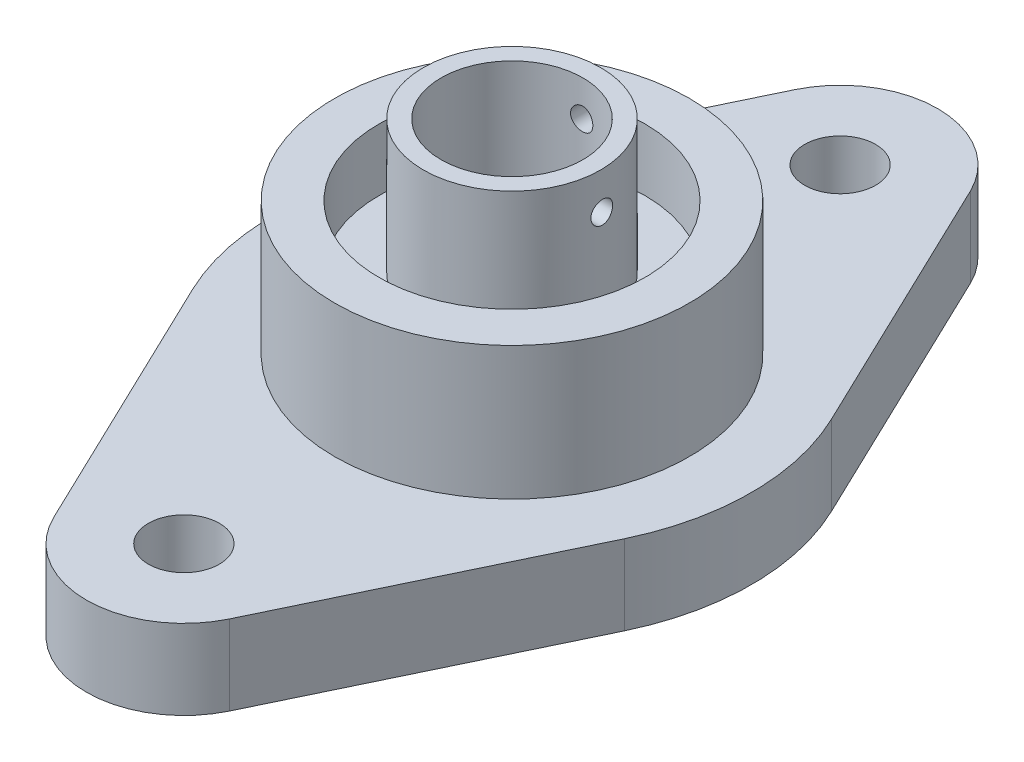
ISO-10303-21;
HEADER;
FILE_DESCRIPTION(('STEP AP214'),'2;1');
FILE_NAME('part.step','',(''),(''),'','','');
FILE_SCHEMA(('AUTOMOTIVE_DESIGN { 1 0 10303 214 1 1 1 1 }'));
ENDSEC;
DATA;
#1=APPLICATION_CONTEXT('core data for automotive mechanical design processes');
#2=APPLICATION_PROTOCOL_DEFINITION('international standard','automotive_design',2000,#1);
#3=PRODUCT_CONTEXT('',#1,'mechanical');
#4=PRODUCT('Part','Part','',(#3));
#5=PRODUCT_RELATED_PRODUCT_CATEGORY('part','',(#4));
#6=PRODUCT_DEFINITION_FORMATION('','',#4);
#7=PRODUCT_DEFINITION_CONTEXT('part definition',#1,'design');
#8=PRODUCT_DEFINITION('design','',#6,#7);
#9=PRODUCT_DEFINITION_SHAPE('','',#8);
#10=(LENGTH_UNIT() NAMED_UNIT(*) SI_UNIT(.MILLI.,.METRE.));
#11=(NAMED_UNIT(*) PLANE_ANGLE_UNIT() SI_UNIT($,.RADIAN.));
#12=(NAMED_UNIT(*) SI_UNIT($,.STERADIAN.) SOLID_ANGLE_UNIT());
#13=UNCERTAINTY_MEASURE_WITH_UNIT(LENGTH_MEASURE(1.E-05),#10,'distance_accuracy_value','');
#14=(GEOMETRIC_REPRESENTATION_CONTEXT(3) GLOBAL_UNCERTAINTY_ASSIGNED_CONTEXT((#13)) GLOBAL_UNIT_ASSIGNED_CONTEXT((#10,
#11,#12)) REPRESENTATION_CONTEXT('',''));
#15=CARTESIAN_POINT('',(0.,0.,0.));
#16=DIRECTION('',(0.,0.,1.));
#17=DIRECTION('',(1.,0.,0.));
#18=AXIS2_PLACEMENT_3D('',#15,#16,#17);
#19=CARTESIAN_POINT('',(0.,12.,0.));
#20=DIRECTION('',(0.,-1.,0.));
#21=DIRECTION('',(0.,0.,-1.));
#22=AXIS2_PLACEMENT_3D('',#19,#20,#21);
#23=CYLINDRICAL_SURFACE('',#22,10.);
#24=CARTESIAN_POINT('',(0.,12.,0.));
#25=DIRECTION('',(0.,-1.,0.));
#26=DIRECTION('',(0.,0.,-1.));
#27=AXIS2_PLACEMENT_3D('',#24,#25,#26);
#28=CIRCLE('',#27,10.);
#29=CARTESIAN_POINT('',(0.,12.,-10.));
#30=VERTEX_POINT('',#29);
#31=EDGE_CURVE('E173',#30,#30,#28,.T.);
#32=ORIENTED_EDGE('',*,*,#31,.T.);
#33=EDGE_LOOP('',(#32));
#34=FACE_BOUND('',#33,.T.);
#35=CARTESIAN_POINT('',(0.,4.5,0.));
#36=DIRECTION('',(0.,-1.,0.));
#37=DIRECTION('',(0.,0.,-1.));
#38=AXIS2_PLACEMENT_3D('',#35,#36,#37);
#39=CIRCLE('',#38,10.);
#40=CARTESIAN_POINT('',(0.,4.5,-10.));
#41=VERTEX_POINT('',#40);
#42=EDGE_CURVE('E141',#41,#41,#39,.T.);
#43=ORIENTED_EDGE('',*,*,#42,.F.);
#44=EDGE_LOOP('',(#43));
#45=FACE_BOUND('',#44,.T.);
#46=ADVANCED_FACE('F36',(#34,#45),#23,.T.);
#47=CARTESIAN_POINT('',(0.,16.,0.));
#48=DIRECTION('',(0.,-1.,0.));
#49=DIRECTION('',(0.,0.,-1.));
#50=AXIS2_PLACEMENT_3D('',#47,#48,#49);
#51=CYLINDRICAL_SURFACE('',#50,5.);
#52=CARTESIAN_POINT('',(4.94713772394498,13.8867766621203,-0.725140221143808));
#53=CARTESIAN_POINT('',(4.94713825606569,13.8518175911723,-0.725138745306085));
#54=CARTESIAN_POINT('',(4.94757066193573,13.8168366708941,-0.722205346936515));
#55=CARTESIAN_POINT('',(4.94925784164685,13.7478483557691,-0.710549195888205));
#56=CARTESIAN_POINT('',(4.95051347481366,13.713842016996,-0.701820393556703));
#57=CARTESIAN_POINT('',(4.9537177623288,13.6478116915913,-0.678832930891845));
#58=CARTESIAN_POINT('',(4.9556659462436,13.6157863765906,-0.664578023718644));
#59=CARTESIAN_POINT('',(4.96005953349321,13.5545945491645,-0.630948205704203));
#60=CARTESIAN_POINT('',(4.96250485181021,13.5254275491845,-0.611574170144945));
#61=CARTESIAN_POINT('',(4.96766548524129,13.4706111003398,-0.568136419447114));
#62=CARTESIAN_POINT('',(4.97038208876387,13.4449799615406,-0.544049748364305));
#63=CARTESIAN_POINT('',(4.97581190977607,13.3981209698855,-0.491915957729279));
#64=CARTESIAN_POINT('',(4.97852512709057,13.3768933360966,-0.463868641258232));
#65=CARTESIAN_POINT('',(4.98370108952014,13.3393782672437,-0.404491197575144));
#66=CARTESIAN_POINT('',(4.98616297668938,13.3231074008454,-0.373150521280687));
#67=CARTESIAN_POINT('',(4.99060183555131,13.2960738621351,-0.308145215958646));
#68=CARTESIAN_POINT('',(4.99257882524003,13.2853109853887,-0.274480673236262));
#69=CARTESIAN_POINT('',(4.99587295620351,13.2696536450367,-0.205968125544459));
#70=CARTESIAN_POINT('',(4.9971934990216,13.2647287424893,-0.171127241988965));
#71=CARTESIAN_POINT('',(4.99910059904821,13.2607928158612,-0.101093816942075));
#72=CARTESIAN_POINT('',(4.99968718513014,13.2617815591322,-0.0659012893390532));
#73=CARTESIAN_POINT('',(5.00011892339072,13.2696204628097,0.00362911137038026));
#74=CARTESIAN_POINT('',(4.99996819437897,13.2764378867406,0.0379706576001916));
#75=CARTESIAN_POINT('',(4.99900927280433,13.2956894562778,0.105031478518251));
#76=CARTESIAN_POINT('',(4.99820106774234,13.308123708662,0.137750722352783));
#77=CARTESIAN_POINT('',(4.99606858976305,13.3382907853162,0.20073713008717));
#78=CARTESIAN_POINT('',(4.99474293410139,13.3560377765528,0.230997459231532));
#79=CARTESIAN_POINT('',(4.99177336357546,13.3963162526743,0.288128957769094));
#80=CARTESIAN_POINT('',(4.99012943411539,13.4188479569874,0.314999971637234));
#81=CARTESIAN_POINT('',(4.98673884061538,13.4682396167699,0.364779019209942));
#82=CARTESIAN_POINT('',(4.98499155120858,13.495128102007,0.387658711909421));
#83=CARTESIAN_POINT('',(4.98164038892562,13.5523720513159,0.428581308517635));
#84=CARTESIAN_POINT('',(4.98003651649901,13.5827275262548,0.446624197265169));
#85=CARTESIAN_POINT('',(4.97718471068476,13.6460690360109,0.47735926254049));
#86=CARTESIAN_POINT('',(4.97593692869296,13.6790561821086,0.490049164279027));
#87=CARTESIAN_POINT('',(4.97396362965131,13.746711525502,0.50969024235337));
#88=CARTESIAN_POINT('',(4.97323808743216,13.7813796416975,0.51664169525574));
#89=CARTESIAN_POINT('',(4.97240816707805,13.8511624576202,0.524569415491981));
#90=CARTESIAN_POINT('',(4.972299632185,13.8862725678925,0.525585669339419));
#91=CARTESIAN_POINT('',(4.9727067546678,13.9561621445366,0.521719428526531));
#92=CARTESIAN_POINT('',(4.97322239873932,13.9909416179401,0.516837059594962));
#93=CARTESIAN_POINT('',(4.97480763022757,14.0590631030148,0.501346886727509));
#94=CARTESIAN_POINT('',(4.97587534408493,14.0924095659179,0.490758442400015));
#95=CARTESIAN_POINT('',(4.97842497726303,14.1568577008336,0.464178787940616));
#96=CARTESIAN_POINT('',(4.97990691113627,14.1879592939305,0.448187387986638));
#97=CARTESIAN_POINT('',(4.98310072503502,14.2472153230735,0.411160526114029));
#98=CARTESIAN_POINT('',(4.98481377803362,14.2753533284489,0.390098873465148));
#99=CARTESIAN_POINT('',(4.98823639954431,14.3277158006041,0.343570095608755));
#100=CARTESIAN_POINT('',(4.98994596791825,14.3519401150873,0.318102799040745));
#101=CARTESIAN_POINT('',(4.99313739683742,14.3959277089539,0.263314899440334));
#102=CARTESIAN_POINT('',(4.99461790392657,14.415664773819,0.233973160316838));
#103=CARTESIAN_POINT('',(4.99712270435212,14.4499362165287,0.17237597199492));
#104=CARTESIAN_POINT('',(4.99814700688424,14.4644706992405,0.140120581542708));
#105=CARTESIAN_POINT('',(4.99956673327385,14.4878811088473,0.0737017346616573));
#106=CARTESIAN_POINT('',(4.999963845206,14.4967721861282,0.0395436570340131));
#107=CARTESIAN_POINT('',(5.00003138907908,14.508692684427,-0.0297807474516453));
#108=CARTESIAN_POINT('',(4.99970185379033,14.5117223697701,-0.0649470287711411));
#109=CARTESIAN_POINT('',(4.99829834779281,14.5118291426933,-0.135033030707256));
#110=CARTESIAN_POINT('',(4.99722946517755,14.5089466522623,-0.169952798531847));
#111=CARTESIAN_POINT('',(4.99441337228877,14.4973965087626,-0.238793343418289));
#112=CARTESIAN_POINT('',(4.99266616248702,14.4887288597174,-0.272714121174894));
#113=CARTESIAN_POINT('',(4.98863169445674,14.4658671335329,-0.338590295974992));
#114=CARTESIAN_POINT('',(4.98634462551514,14.451674992277,-0.370546376947094));
#115=CARTESIAN_POINT('',(4.98142976817213,14.4181713334684,-0.43162170836908));
#116=CARTESIAN_POINT('',(4.97880197572033,14.3988597550549,-0.460740925088158));
#117=CARTESIAN_POINT('',(4.9734291270666,14.3555158582862,-0.515525496576239));
#118=CARTESIAN_POINT('',(4.97068341582527,14.3314534637394,-0.541166993116929));
#119=CARTESIAN_POINT('',(4.96535369998408,14.2793534261131,-0.588065681790942));
#120=CARTESIAN_POINT('',(4.9627697338425,14.2513148427476,-0.609321833954347));
#121=CARTESIAN_POINT('',(4.95800925485121,14.191934181446,-0.646920289136648));
#122=CARTESIAN_POINT('',(4.95583435398402,14.1605797646365,-0.663243299521477));
#123=CARTESIAN_POINT('',(4.95212725176997,14.0955624769716,-0.690380291157548));
#124=CARTESIAN_POINT('',(4.95059435173692,14.0619021622944,-0.701200264100645));
#125=CARTESIAN_POINT('',(4.9486976555333,14.0045191653594,-0.714436038000361));
#126=CARTESIAN_POINT('',(4.94811530648013,13.9811584242359,-0.718444370035397));
#127=CARTESIAN_POINT('',(4.94733516192253,13.9341273496286,-0.723796951347462));
#128=CARTESIAN_POINT('',(4.94713736350039,13.9104570184951,-0.725141220837516));
#129=CARTESIAN_POINT('',(4.94713772394498,13.8867766621203,-0.725140221143808));
#130=B_SPLINE_CURVE_WITH_KNOTS('',3,(#52,#53,#54,#55,#56,#57,#58,#59,#60,#61,#62,#63,#64,#65,
#66,#67,#68,#69,#70,#71,#72,#73,#74,#75,#76,#77,#78,#79,#80,#81,#82,#83,#84,#85,#86,#87,#88,#89,
#90,#91,#92,#93,#94,#95,#96,#97,#98,#99,#100,#101,#102,#103,#104,#105,#106,#107,#108,#109,#110,
#111,#112,#113,#114,#115,#116,#117,#118,#119,#120,#121,#122,#123,#124,#125,#126,#127,#128,#129),
.UNSPECIFIED.,.T.,.F.,(4,2,2,2,2,2,2,2,2,2,2,2,2,2,2,2,2,2,2,2,2,2,2,2,2,2,2,2,2,2,2,2,2,2,2,2,
2,2,4),(0.,0.104790704369808,0.209690969038095,0.314520113145303,0.419331344876532,
0.524666443872664,0.630006781856446,0.735695465364351,0.841380225849575,0.946511492353643,
1.05163862292527,1.15617916233259,1.26072168917947,1.36554551103201,1.47037414117276,
1.57591924344442,1.68146467654856,1.78705491684752,1.89264006789047,1.99751304451471,
2.10238378581779,2.20690094073183,2.31142176802963,2.41649454886028,2.52157141748703,
2.62724721473085,2.73292088177219,2.83830964196235,2.94369364943203,3.04835954072064,
3.15302535921697,3.25765453386022,3.36228495241062,3.46760032222709,3.57294063859957,
3.67868774426208,3.78431946495504,3.85530247408237,3.92628494463868),.UNSPECIFIED.);
#131=CARTESIAN_POINT('',(4.94713772394498,13.8867766621203,-0.725140221143808));
#132=VERTEX_POINT('',#131);
#133=EDGE_CURVE('E468',#132,#132,#130,.T.);
#134=ORIENTED_EDGE('',*,*,#133,.T.);
#135=EDGE_LOOP('',(#134));
#136=FACE_BOUND('',#135,.T.);
#137=CARTESIAN_POINT('',(0.,14.607453731981,-5.));
#138=CARTESIAN_POINT('',(-0.0348990786235977,14.6090409833359,-4.99999950745355));
#139=CARTESIAN_POINT('',(-0.0699533404629345,14.6076964405771,-4.99963074611788));
#140=CARTESIAN_POINT('',(-0.139354207996636,14.5991706109528,-4.99817853173998));
#141=CARTESIAN_POINT('',(-0.173700048696205,14.5919833217477,-4.99709434394535));
#142=CARTESIAN_POINT('',(-0.24066560791235,14.5719861694536,-4.99431702296796));
#143=CARTESIAN_POINT('',(-0.273286421961319,14.5591799241023,-4.99262428172586));
#144=CARTESIAN_POINT('',(-0.335905598031991,14.5283186042426,-4.98880272458806));
#145=CARTESIAN_POINT('',(-0.365904401202672,14.5102644149118,-4.98667398225111));
#146=CARTESIAN_POINT('',(-0.422592256967548,14.4693206497872,-4.9821912013479));
#147=CARTESIAN_POINT('',(-0.449265309510713,14.4464090304725,-4.97983616341303));
#148=CARTESIAN_POINT('',(-0.498400742647147,14.3964398990314,-4.97515901764027));
#149=CARTESIAN_POINT('',(-0.520862880488868,14.3693821480513,-4.97283691170797));
#150=CARTESIAN_POINT('',(-0.561036811924267,14.3117435986718,-4.96846547156364));
#151=CARTESIAN_POINT('',(-0.578727177493775,14.2811477618756,-4.96641738793399));
#152=CARTESIAN_POINT('',(-0.608716516738866,14.2173911293658,-4.9628311976545));
#153=CARTESIAN_POINT('',(-0.62101565822422,14.1842304135256,-4.96129307513173));
#154=CARTESIAN_POINT('',(-0.63982034280399,14.1164339474778,-4.95890312118309));
#155=CARTESIAN_POINT('',(-0.646350457189598,14.0818051178657,-4.95804838060838));
#156=CARTESIAN_POINT('',(-0.653511453597567,14.0119331603042,-4.95710966228365));
#157=CARTESIAN_POINT('',(-0.654142602864343,13.976690060256,-4.95702564961687));
#158=CARTESIAN_POINT('',(-0.649502352514769,13.9068280771058,-4.95763570792191));
#159=CARTESIAN_POINT('',(-0.644268497525465,13.8722066486604,-4.9583248297326));
#160=CARTESIAN_POINT('',(-0.628113582074112,13.8043392537621,-4.96039705595205));
#161=CARTESIAN_POINT('',(-0.617192451440327,13.7710933042858,-4.96178016892352));
#162=CARTESIAN_POINT('',(-0.589958934725137,13.706858391694,-4.96509172145371));
#163=CARTESIAN_POINT('',(-0.573638322737793,13.675872960848,-4.96702099241225));
#164=CARTESIAN_POINT('',(-0.536073000190021,13.6170714478374,-4.97121530889957));
#165=CARTESIAN_POINT('',(-0.514828061561889,13.5892555125554,-4.97348036997856));
#166=CARTESIAN_POINT('',(-0.467838649719816,13.5373757070118,-4.97812081484077));
#167=CARTESIAN_POINT('',(-0.442063602619569,13.5133395806667,-4.98049686210371));
#168=CARTESIAN_POINT('',(-0.386834833384578,13.4699295923599,-4.98509029487401));
#169=CARTESIAN_POINT('',(-0.357381070174703,13.450555782463,-4.98730767860936));
#170=CARTESIAN_POINT('',(-0.295565836500636,13.4169947385871,-4.99135256890982));
#171=CARTESIAN_POINT('',(-0.263199763103714,13.4028159012417,-4.99317944232546));
#172=CARTESIAN_POINT('',(-0.196517676739934,13.3801044011434,-4.99624796247671));
#173=CARTESIAN_POINT('',(-0.162201749481776,13.3715714904236,-4.99748963491342));
#174=CARTESIAN_POINT('',(-0.0928221125703909,13.3604412189474,-4.99925798024883));
#175=CARTESIAN_POINT('',(-0.0577643942774412,13.3578072070568,-4.99978905986317));
#176=CARTESIAN_POINT('',(0.0122999535595478,13.3584453617253,-5.00010758883449));
#177=CARTESIAN_POINT('',(0.0473065845348258,13.3617173595171,-4.99989505944032));
#178=CARTESIAN_POINT('',(0.116116897679981,13.3740421478164,-4.99876949049106));
#179=CARTESIAN_POINT('',(0.149925142394937,13.3830697808285,-4.99785949602671));
#180=CARTESIAN_POINT('',(0.215548939611965,13.406618175544,-4.99545970710277));
#181=CARTESIAN_POINT('',(0.247364436466622,13.4211390905676,-4.99396989646019));
#182=CARTESIAN_POINT('',(0.308248953747447,13.4553316942846,-4.99058286203805));
#183=CARTESIAN_POINT('',(0.337305780705717,13.475024921935,-4.98868394069376));
#184=CARTESIAN_POINT('',(0.3917169066205,13.5189794609665,-4.98470695318134));
#185=CARTESIAN_POINT('',(0.417071044018995,13.543240971568,-4.98262887920261));
#186=CARTESIAN_POINT('',(0.463521230467004,13.5958266843897,-4.97852352829136));
#187=CARTESIAN_POINT('',(0.484589366710118,13.6241755847198,-4.97649665521401));
#188=CARTESIAN_POINT('',(0.52166642628248,13.6840271730162,-4.97274699846433));
#189=CARTESIAN_POINT('',(0.537675405567654,13.7155298260958,-4.9710242114288));
#190=CARTESIAN_POINT('',(0.564151090067189,13.7807560735333,-4.96808934918778));
#191=CARTESIAN_POINT('',(0.574625474591577,13.8144765171955,-4.96687656682513));
#192=CARTESIAN_POINT('',(0.58975397425783,13.8832148968479,-4.96510312009983));
#193=CARTESIAN_POINT('',(0.594408367247411,13.9182327708163,-4.96454242460648));
#194=CARTESIAN_POINT('',(0.597745261301449,13.9883085967834,-4.96414176441681));
#195=CARTESIAN_POINT('',(0.596469493173449,14.0233645383625,-4.96429676329614));
#196=CARTESIAN_POINT('',(0.588079892575132,14.0927600334134,-4.96529752624628));
#197=CARTESIAN_POINT('',(0.580966109412059,14.1270995929332,-4.96614328448301));
#198=CARTESIAN_POINT('',(0.56112791289088,14.1940342678777,-4.96842370393741));
#199=CARTESIAN_POINT('',(0.548412735902528,14.2266321564078,-4.9698573954198));
#200=CARTESIAN_POINT('',(0.517741556121543,14.289237025161,-4.9731459248822));
#201=CARTESIAN_POINT('',(0.499785503659278,14.3192439808253,-4.97500076685357));
#202=CARTESIAN_POINT('',(0.459011828816326,14.3760184341958,-4.97892849124653));
#203=CARTESIAN_POINT('',(0.436164715665284,14.402764663221,-4.9810026558697));
#204=CARTESIAN_POINT('',(0.386308465565209,14.4520635862687,-4.98511684298613));
#205=CARTESIAN_POINT('',(0.359298320206447,14.4746152613174,-4.98715685707404));
#206=CARTESIAN_POINT('',(0.301732842808365,14.5149844508981,-4.99097111433494));
#207=CARTESIAN_POINT('',(0.27116088376575,14.5327783713772,-4.9927440145996));
#208=CARTESIAN_POINT('',(0.207459439867549,14.5629591249918,-4.99579554810902));
#209=CARTESIAN_POINT('',(0.174332756213826,14.5753517840147,-4.99707471373259));
#210=CARTESIAN_POINT('',(0.11754052986544,14.5912843135636,-4.99867086192337));
#211=CARTESIAN_POINT('',(0.0943075235513967,14.5963929137859,-4.99916553230591));
#212=CARTESIAN_POINT('',(0.0474069445395791,14.6039377664027,-4.99983026775193));
#213=CARTESIAN_POINT('',(0.0237393748271242,14.6063740371482,-5.00000033504451));
#214=CARTESIAN_POINT('',(0.,14.607453731981,-5.));
#215=B_SPLINE_CURVE_WITH_KNOTS('',3,(#137,#138,#139,#140,#141,#142,#143,#144,#145,#146,#147,
#148,#149,#150,#151,#152,#153,#154,#155,#156,#157,#158,#159,#160,#161,#162,#163,#164,#165,#166,
#167,#168,#169,#170,#171,#172,#173,#174,#175,#176,#177,#178,#179,#180,#181,#182,#183,#184,#185,
#186,#187,#188,#189,#190,#191,#192,#193,#194,#195,#196,#197,#198,#199,#200,#201,#202,#203,#204,
#205,#206,#207,#208,#209,#210,#211,#212,#213,#214),.UNSPECIFIED.,.T.,.F.,(4,2,2,2,2,2,2,2,2,2,2,
2,2,2,2,2,2,2,2,2,2,2,2,2,2,2,2,2,2,2,2,2,2,2,2,2,2,2,4),(0.,0.104718779087226,
0.209545273474578,0.31430437464196,0.419045816199098,0.524273168898632,0.629506585898842,
0.735204978806177,0.840900081462057,0.946142809251875,1.05138076914309,1.15594888096957,
1.26051828302715,1.36524773190106,1.46998203223613,1.57545241779691,1.68092398110482,
1.78656527380671,1.89220192647677,1.99718039312081,2.10215585999827,2.2066756027895,
2.3111982629908,2.41616328283523,2.52113288121021,2.62676563486297,2.73239722014215,
2.8378818530133,2.94336144983188,3.04809991026021,3.15283748608791,3.25740299850829,
3.36196950196521,3.4671852029078,3.57242643038134,3.67818026411316,3.78381974605637,
3.85505301403237,3.92628579284017),.UNSPECIFIED.);
#216=CARTESIAN_POINT('',(0.,14.607453731981,-5.));
#217=VERTEX_POINT('',#216);
#218=EDGE_CURVE('E305',#217,#217,#215,.T.);
#219=ORIENTED_EDGE('',*,*,#218,.T.);
#220=EDGE_LOOP('',(#219));
#221=FACE_BOUND('',#220,.T.);
#222=CARTESIAN_POINT('',(0.,16.,0.));
#223=DIRECTION('',(0.,1.,0.));
#224=DIRECTION('',(0.,0.,1.));
#225=AXIS2_PLACEMENT_3D('',#222,#223,#224);
#226=CIRCLE('',#225,5.);
#227=CARTESIAN_POINT('',(0.,16.,5.));
#228=VERTEX_POINT('',#227);
#229=EDGE_CURVE('E46',#228,#228,#226,.T.);
#230=ORIENTED_EDGE('',*,*,#229,.F.);
#231=EDGE_LOOP('',(#230));
#232=FACE_BOUND('',#231,.T.);
#233=CARTESIAN_POINT('',(0.,8.5,0.));
#234=DIRECTION('',(0.,-1.,0.));
#235=DIRECTION('',(0.,0.,-1.));
#236=AXIS2_PLACEMENT_3D('',#233,#234,#235);
#237=CIRCLE('',#236,5.);
#238=CARTESIAN_POINT('',(0.,8.5,-5.));
#239=VERTEX_POINT('',#238);
#240=EDGE_CURVE('E11',#239,#239,#237,.T.);
#241=ORIENTED_EDGE('',*,*,#240,.F.);
#242=EDGE_LOOP('',(#241));
#243=FACE_BOUND('',#242,.T.);
#244=ADVANCED_FACE('F38',(#136,#221,#232,#243),#51,.T.);
#245=CARTESIAN_POINT('',(0.,16.,0.));
#246=DIRECTION('',(0.,1.,0.));
#247=DIRECTION('',(0.,0.,1.));
#248=AXIS2_PLACEMENT_3D('',#245,#246,#247);
#249=PLANE('',#248);
#250=ORIENTED_EDGE('',*,*,#229,.T.);
#251=EDGE_LOOP('',(#250));
#252=FACE_BOUND('',#251,.T.);
#253=CARTESIAN_POINT('',(0.,16.,0.));
#254=DIRECTION('',(0.,1.,0.));
#255=DIRECTION('',(0.,0.,1.));
#256=AXIS2_PLACEMENT_3D('',#253,#254,#255);
#257=CIRCLE('',#256,4.);
#258=CARTESIAN_POINT('',(0.,16.,4.));
#259=VERTEX_POINT('',#258);
#260=EDGE_CURVE('E180',#259,#259,#257,.T.);
#261=ORIENTED_EDGE('',*,*,#260,.F.);
#262=EDGE_LOOP('',(#261));
#263=FACE_BOUND('',#262,.T.);
#264=ADVANCED_FACE('F187',(#252,#263),#249,.T.);
#265=CARTESIAN_POINT('',(0.,0.,0.));
#266=DIRECTION('',(0.,1.,0.));
#267=DIRECTION('',(0.,0.,1.));
#268=AXIS2_PLACEMENT_3D('',#265,#266,#267);
#269=PLANE('',#268);
#270=CARTESIAN_POINT('',(0.,0.,0.));
#271=DIRECTION('',(0.,1.,0.));
#272=DIRECTION('',(0.,0.,1.));
#273=AXIS2_PLACEMENT_3D('',#270,#271,#272);
#274=CIRCLE('',#273,4.);
#275=CARTESIAN_POINT('',(0.,0.,4.));
#276=VERTEX_POINT('',#275);
#277=EDGE_CURVE('E179',#276,#276,#274,.T.);
#278=ORIENTED_EDGE('',*,*,#277,.T.);
#279=EDGE_LOOP('',(#278));
#280=FACE_BOUND('',#279,.T.);
#281=CARTESIAN_POINT('',(0.,0.,-18.5));
#282=DIRECTION('',(0.,-1.,0.));
#283=DIRECTION('',(0.,0.,-1.));
#284=AXIS2_PLACEMENT_3D('',#281,#282,#283);
#285=CIRCLE('',#284,2.);
#286=CARTESIAN_POINT('',(0.,0.,-20.5));
#287=VERTEX_POINT('',#286);
#288=EDGE_CURVE('E236',#287,#287,#285,.T.);
#289=ORIENTED_EDGE('',*,*,#288,.F.);
#290=EDGE_LOOP('',(#289));
#291=FACE_BOUND('',#290,.T.);
#292=CARTESIAN_POINT('',(0.,0.,18.5));
#293=DIRECTION('',(0.,-1.,0.));
#294=DIRECTION('',(0.,0.,-1.));
#295=AXIS2_PLACEMENT_3D('',#292,#293,#294);
#296=CIRCLE('',#295,2.);
#297=CARTESIAN_POINT('',(0.,0.,16.5));
#298=VERTEX_POINT('',#297);
#299=EDGE_CURVE('E240',#298,#298,#296,.T.);
#300=ORIENTED_EDGE('',*,*,#299,.F.);
#301=EDGE_LOOP('',(#300));
#302=FACE_BOUND('',#301,.T.);
#303=CARTESIAN_POINT('',(0.,0.,-18.5));
#304=DIRECTION('',(0.,-1.,0.));
#305=DIRECTION('',(0.,0.,-1.));
#306=AXIS2_PLACEMENT_3D('',#303,#304,#305);
#307=CIRCLE('',#306,5.5);
#308=CARTESIAN_POINT('',(-4.95916487820906,0.,-20.8783783783784));
#309=VERTEX_POINT('',#308);
#310=CARTESIAN_POINT('',(4.95916487820906,0.,-20.8783783783784));
#311=VERTEX_POINT('',#310);
#312=EDGE_CURVE('E137',#309,#311,#307,.T.);
#313=ORIENTED_EDGE('',*,*,#312,.T.);
#314=DIRECTION('',(0.432432432432432,0.,0.901666341492556));
#315=VECTOR('',#314,1.);
#316=CARTESIAN_POINT('',(4.95916487820906,0.,-20.8783783783784));
#317=LINE('',#316,#315);
#318=CARTESIAN_POINT('',(12.1724956101495,0.,-5.83783783783784));
#319=VERTEX_POINT('',#318);
#320=EDGE_CURVE('E140',#311,#319,#317,.T.);
#321=ORIENTED_EDGE('',*,*,#320,.T.);
#322=CARTESIAN_POINT('',(0.,0.,0.));
#323=DIRECTION('',(0.,-1.,0.));
#324=DIRECTION('',(0.,0.,-1.));
#325=AXIS2_PLACEMENT_3D('',#322,#323,#324);
#326=CIRCLE('',#325,13.5);
#327=CARTESIAN_POINT('',(12.1724956101495,0.,5.83783783783784));
#328=VERTEX_POINT('',#327);
#329=EDGE_CURVE('E144',#319,#328,#326,.T.);
#330=ORIENTED_EDGE('',*,*,#329,.T.);
#331=DIRECTION('',(-0.432432432432432,0.,0.901666341492555));
#332=VECTOR('',#331,1.);
#333=CARTESIAN_POINT('',(12.1724956101495,0.,5.83783783783784));
#334=LINE('',#333,#332);
#335=CARTESIAN_POINT('',(4.95916487820906,0.,20.8783783783784));
#336=VERTEX_POINT('',#335);
#337=EDGE_CURVE('E147',#328,#336,#334,.T.);
#338=ORIENTED_EDGE('',*,*,#337,.T.);
#339=CARTESIAN_POINT('',(0.,0.,18.5));
#340=DIRECTION('',(0.,-1.,0.));
#341=DIRECTION('',(0.,0.,-1.));
#342=AXIS2_PLACEMENT_3D('',#339,#340,#341);
#343=CIRCLE('',#342,5.5);
#344=CARTESIAN_POINT('',(-4.95916487820905,0.,20.8783783783784));
#345=VERTEX_POINT('',#344);
#346=EDGE_CURVE('E150',#336,#345,#343,.T.);
#347=ORIENTED_EDGE('',*,*,#346,.T.);
#348=DIRECTION('',(-0.432432432432432,0.,-0.901666341492555));
#349=VECTOR('',#348,1.);
#350=CARTESIAN_POINT('',(-12.1724956101495,0.,5.83783783783784));
#351=LINE('',#350,#349);
#352=CARTESIAN_POINT('',(-12.1724956101495,0.,5.83783783783784));
#353=VERTEX_POINT('',#352);
#354=EDGE_CURVE('E153',#345,#353,#351,.T.);
#355=ORIENTED_EDGE('',*,*,#354,.T.);
#356=CARTESIAN_POINT('',(0.,0.,0.));
#357=DIRECTION('',(0.,-1.,0.));
#358=DIRECTION('',(0.,0.,-1.));
#359=AXIS2_PLACEMENT_3D('',#356,#357,#358);
#360=CIRCLE('',#359,13.5);
#361=CARTESIAN_POINT('',(-12.1724956101495,0.,-5.83783783783784));
#362=VERTEX_POINT('',#361);
#363=EDGE_CURVE('E114',#353,#362,#360,.T.);
#364=ORIENTED_EDGE('',*,*,#363,.T.);
#365=DIRECTION('',(0.432432432432432,0.,-0.901666341492556));
#366=VECTOR('',#365,1.);
#367=CARTESIAN_POINT('',(-4.95916487820906,0.,-20.8783783783784));
#368=LINE('',#367,#366);
#369=EDGE_CURVE('E156',#362,#309,#368,.T.);
#370=ORIENTED_EDGE('',*,*,#369,.T.);
#371=EDGE_LOOP('',(#313,#321,#330,#338,#347,#355,#364,#370));
#372=FACE_BOUND('',#371,.T.);
#373=ADVANCED_FACE('F224',(#280,#291,#302,#372),#269,.F.);
#374=CARTESIAN_POINT('',(0.,16.,0.));
#375=DIRECTION('',(0.,-1.,0.));
#376=DIRECTION('',(0.,0.,-1.));
#377=AXIS2_PLACEMENT_3D('',#374,#375,#376);
#378=CYLINDRICAL_SURFACE('',#377,4.);
#379=CARTESIAN_POINT('',(3.93743048374927,13.8867766621203,-0.704727738663629));
#380=CARTESIAN_POINT('',(3.93743111388884,13.8519008175385,-0.704726324059104));
#381=CARTESIAN_POINT('',(3.9379563845063,13.8170051627092,-0.701808716270004));
#382=CARTESIAN_POINT('',(3.9400040441188,13.748190754879,-0.690218400812287));
#383=CARTESIAN_POINT('',(3.9415273864169,13.7142729682523,-0.681540190829657));
#384=CARTESIAN_POINT('',(3.94540953033083,13.6484202647059,-0.658693397987712));
#385=CARTESIAN_POINT('',(3.94776766996881,13.6164838001517,-0.644529164601932));
#386=CARTESIAN_POINT('',(3.95307702039055,13.5554524394107,-0.611119344863482));
#387=CARTESIAN_POINT('',(3.95602815494586,13.5263571787057,-0.591874411526111));
#388=CARTESIAN_POINT('',(3.96225231240645,13.4715775408322,-0.5486668844649));
#389=CARTESIAN_POINT('',(3.96552765612365,13.4459213935203,-0.524668829879256));
#390=CARTESIAN_POINT('',(3.97205633717347,13.3989931070129,-0.472707904350333));
#391=CARTESIAN_POINT('',(3.97530967325245,13.3777212155642,-0.44474480949996));
#392=CARTESIAN_POINT('',(3.9814960351793,13.34006044286,-0.385461747920042));
#393=CARTESIAN_POINT('',(3.98442729823708,13.3236976611267,-0.354125001908607));
#394=CARTESIAN_POINT('',(3.9896726244237,13.296487173439,-0.289093797436651));
#395=CARTESIAN_POINT('',(3.99198672288049,13.2856391517746,-0.255399474068847));
#396=CARTESIAN_POINT('',(3.99577725641529,13.2698519823813,-0.186897596129903));
#397=CARTESIAN_POINT('',(3.99726035051072,13.2648654998532,-0.152101322891659));
#398=CARTESIAN_POINT('',(3.99930961511527,13.2607959012945,-0.082139546519149));
#399=CARTESIAN_POINT('',(3.99987584071949,13.2617124305323,-0.0469740656985691));
#400=CARTESIAN_POINT('',(4.0000864350675,13.2693856436898,0.0224044174494028));
#401=CARTESIAN_POINT('',(3.99973878921609,13.2760913968304,0.0566230476896054));
#402=CARTESIAN_POINT('',(3.99823409458574,13.295072669276,0.123459572668431));
#403=CARTESIAN_POINT('',(3.99707702355366,13.3073483417088,0.156077423371188));
#404=CARTESIAN_POINT('',(3.99412841361293,13.3371725760853,0.218936824622381));
#405=CARTESIAN_POINT('',(3.99233430939574,13.3547424134773,0.249168154056657));
#406=CARTESIAN_POINT('',(3.9883597039418,13.3946406822776,0.306280372867824));
#407=CARTESIAN_POINT('',(3.98617917514582,13.416969453109,0.33316102304619));
#408=CARTESIAN_POINT('',(3.98169146516916,13.4660350338886,0.38310537843924));
#409=CARTESIAN_POINT('',(3.9793831809967,13.492816328719,0.406125304100341));
#410=CARTESIAN_POINT('',(3.97496059010698,13.5498760532908,0.447347116094155));
#411=CARTESIAN_POINT('',(3.97284628478529,13.5801545081888,0.465548967765308));
#412=CARTESIAN_POINT('',(3.96908230731476,13.6433965691467,0.496620580911637));
#413=CARTESIAN_POINT('',(3.96743305301343,13.6763625558887,0.509485552067579));
#414=CARTESIAN_POINT('',(3.96481586897039,13.7440178742967,0.52946923136137));
#415=CARTESIAN_POINT('',(3.96384788690177,13.7787070733877,0.536588380828407));
#416=CARTESIAN_POINT('',(3.96272549119939,13.8484336879391,0.544815557612071));
#417=CARTESIAN_POINT('',(3.96256263410272,13.883463612169,0.545985973830055));
#418=CARTESIAN_POINT('',(3.96304848474723,13.9532185709448,0.54244794505069));
#419=CARTESIAN_POINT('',(3.96369716508228,13.9879436157468,0.537739698579448));
#420=CARTESIAN_POINT('',(3.96571714197399,14.0559086139869,0.522632291616115));
#421=CARTESIAN_POINT('',(3.96708445986583,14.0891556617802,0.512264452803947));
#422=CARTESIAN_POINT('',(3.97036687009455,14.1534451548963,0.486167510793675));
#423=CARTESIAN_POINT('',(3.97228199158345,14.1844874827825,0.470438122265931));
#424=CARTESIAN_POINT('',(3.97643723641938,14.2437644825325,0.433919459689403));
#425=CARTESIAN_POINT('',(3.97867988050385,14.2719742193453,0.413090005775163));
#426=CARTESIAN_POINT('',(3.9831932737684,14.3245284073323,0.367022726955648));
#427=CARTESIAN_POINT('',(3.98546402466963,14.3488726205221,0.341784630828937));
#428=CARTESIAN_POINT('',(3.98975976819836,14.3932294797792,0.287346109402204));
#429=CARTESIAN_POINT('',(3.99178234321388,14.4132008062278,0.258111800232547));
#430=CARTESIAN_POINT('',(3.99528015403923,14.4479565421179,0.196676793992626));
#431=CARTESIAN_POINT('',(3.99675540584352,14.4627411031318,0.164476183641129));
#432=CARTESIAN_POINT('',(3.99893254955454,14.4866382309413,0.0981531077846489));
#433=CARTESIAN_POINT('',(3.99963748213363,14.4957730364801,0.0640387615029161));
#434=CARTESIAN_POINT('',(4.00014647433593,14.5081831952885,-0.00524547953268113));
#435=CARTESIAN_POINT('',(3.99995059875191,14.5114589699593,-0.040415298188401));
#436=CARTESIAN_POINT('',(3.99862749207636,14.5120471252841,-0.110411290291849));
#437=CARTESIAN_POINT('',(3.9975101947951,14.509422598281,-0.145237137692507));
#438=CARTESIAN_POINT('',(3.99442326055469,14.4984203330752,-0.213928068456903));
#439=CARTESIAN_POINT('',(3.99245362702569,14.4900426180257,-0.247793155686557));
#440=CARTESIAN_POINT('',(3.98782557207148,14.4677948471922,-0.313583637192414));
#441=CARTESIAN_POINT('',(3.98516774486378,14.453929524225,-0.345510675653852));
#442=CARTESIAN_POINT('',(3.97940083146641,14.4211069524899,-0.406584659708774));
#443=CARTESIAN_POINT('',(3.9762917281441,14.4021495103771,-0.435731499682721));
#444=CARTESIAN_POINT('',(3.96988029533264,14.3594543013179,-0.490740451240068));
#445=CARTESIAN_POINT('',(3.96657632835361,14.335670083543,-0.516566322694238));
#446=CARTESIAN_POINT('',(3.96012702393599,14.2840941727877,-0.563884493205164));
#447=CARTESIAN_POINT('',(3.95698172386442,14.2563015416938,-0.585375774979653));
#448=CARTESIAN_POINT('',(3.95114862207436,14.1972963860475,-0.623538804297772));
#449=CARTESIAN_POINT('',(3.94846374614632,14.1660639224517,-0.640180168398394));
#450=CARTESIAN_POINT('',(3.94385819355486,14.1012158576965,-0.667969060985544));
#451=CARTESIAN_POINT('',(3.94193673492912,14.0676027368368,-0.679122213812007));
#452=CARTESIAN_POINT('',(3.93949291790551,14.0093342271985,-0.693129322811578));
#453=CARTESIAN_POINT('',(3.93872333905223,13.985036262125,-0.697472010943768));
#454=CARTESIAN_POINT('',(3.93769190292971,13.9360877168578,-0.70327169774548));
#455=CARTESIAN_POINT('',(3.93743003818174,13.9114371418636,-0.704728738921161));
#456=CARTESIAN_POINT('',(3.93743048374927,13.8867766621203,-0.704727738663629));
#457=B_SPLINE_CURVE_WITH_KNOTS('',3,(#379,#380,#381,#382,#383,#384,#385,#386,#387,#388,#389,
#390,#391,#392,#393,#394,#395,#396,#397,#398,#399,#400,#401,#402,#403,#404,#405,#406,#407,#408,
#409,#410,#411,#412,#413,#414,#415,#416,#417,#418,#419,#420,#421,#422,#423,#424,#425,#426,#427,
#428,#429,#430,#431,#432,#433,#434,#435,#436,#437,#438,#439,#440,#441,#442,#443,#444,#445,#446,
#447,#448,#449,#450,#451,#452,#453,#454,#455,#456),.UNSPECIFIED.,.T.,.F.,(4,2,2,2,2,2,2,2,2,2,2,
2,2,2,2,2,2,2,2,2,2,2,2,2,2,2,2,2,2,2,2,2,2,2,2,2,2,2,4),(0.,0.104537381970647,
0.209174758133979,0.313729344103093,0.418270498353517,0.523623145118175,0.628981743551664,
0.734890945046198,0.840794082746893,0.945835993784252,1.05087159256628,1.15499244786742,
1.2591161658269,1.36366403231754,1.46821935800937,1.57389010847868,1.6795616191301,
1.78532777508708,1.89108580650809,1.99573235007661,2.10037535976162,2.20444503362056,
2.30852024669885,2.41344338208291,2.51837297465507,2.62425492998867,2.73013379088243,
2.83559319057106,2.94104500495909,3.04537458517296,3.14970374552502,3.2539431220284,
3.3581864570022,3.46348510099499,3.56880842878145,3.67477805414639,3.78063885408471,
3.85455763643566,3.92847532994002),.UNSPECIFIED.);
#458=CARTESIAN_POINT('',(3.93743048374927,13.8867766621203,-0.704727738663629));
#459=VERTEX_POINT('',#458);
#460=EDGE_CURVE('E465',#459,#459,#457,.T.);
#461=ORIENTED_EDGE('',*,*,#460,.F.);
#462=EDGE_LOOP('',(#461));
#463=FACE_BOUND('',#462,.T.);
#464=CARTESIAN_POINT('',(0.,14.6076865997547,-4.));
#465=CARTESIAN_POINT('',(-0.0348242114303786,14.6089529689373,-3.99999942212039));
#466=CARTESIAN_POINT('',(-0.0697743038189787,14.6073008056298,-3.99954046377523));
#467=CARTESIAN_POINT('',(-0.138909600620988,14.598197982387,-3.99773726264242));
#468=CARTESIAN_POINT('',(-0.17309405953201,14.5907419038522,-3.99639219275165));
#469=CARTESIAN_POINT('',(-0.239684616219135,14.5702601037972,-3.99295157035486));
#470=CARTESIAN_POINT('',(-0.272092013758414,14.5572385159561,-3.99085657502934));
#471=CARTESIAN_POINT('',(-0.334252134674253,14.5260085825345,-3.98613200295987));
#472=CARTESIAN_POINT('',(-0.364005193084246,14.5078008927691,-3.98350249382057));
#473=CARTESIAN_POINT('',(-0.420259565948605,14.4665605932137,-3.97796275109865));
#474=CARTESIAN_POINT('',(-0.446735851769558,14.4434940965612,-3.97505062775351));
#475=CARTESIAN_POINT('',(-0.495461678150866,14.3932537798493,-3.9692721134041));
#476=CARTESIAN_POINT('',(-0.517710931936977,14.3660796813425,-3.96640572551474));
#477=CARTESIAN_POINT('',(-0.557497948988027,14.3081737940903,-3.96101036666064));
#478=CARTESIAN_POINT('',(-0.575003170185589,14.2774194037672,-3.95848378328438));
#479=CARTESIAN_POINT('',(-0.604594844101921,14.2133626701074,-3.95407260047078));
#480=CARTESIAN_POINT('',(-0.616681569772271,14.1800604552139,-3.9521879686969));
#481=CARTESIAN_POINT('',(-0.635009116603443,14.1120950510621,-3.94928470536655));
#482=CARTESIAN_POINT('',(-0.641289782970239,14.0774428649537,-3.94826017572429));
#483=CARTESIAN_POINT('',(-0.647955269441986,14.0075621614789,-3.94717187059012));
#484=CARTESIAN_POINT('',(-0.648340497214422,13.9723336841315,-3.947108028667));
#485=CARTESIAN_POINT('',(-0.643229805488639,13.902669122503,-3.94794397636152));
#486=CARTESIAN_POINT('',(-0.637791868608827,13.8682286495942,-3.94883426554258));
#487=CARTESIAN_POINT('',(-0.621290286764608,13.8007574749408,-3.95146396478905));
#488=CARTESIAN_POINT('',(-0.610226524522903,13.7677268026008,-3.95320339255578));
#489=CARTESIAN_POINT('',(-0.582760726111514,13.7039056683211,-3.95734535043519));
#490=CARTESIAN_POINT('',(-0.566344397630932,13.6731214772464,-3.95974965324372));
#491=CARTESIAN_POINT('',(-0.528646755955105,13.6147289758782,-3.96495818833038));
#492=CARTESIAN_POINT('',(-0.507365093942272,13.5871208935077,-3.96776244927787));
#493=CARTESIAN_POINT('',(-0.460260848825934,13.5355427308424,-3.97350319742794));
#494=CARTESIAN_POINT('',(-0.434390791365695,13.5116161126937,-3.97644080152211));
#495=CARTESIAN_POINT('',(-0.378985500101965,13.4684359342197,-3.9821029728698));
#496=CARTESIAN_POINT('',(-0.34945020636606,13.4491824503228,-3.9848275366386));
#497=CARTESIAN_POINT('',(-0.287458785738504,13.4158598605815,-3.98977884455266));
#498=CARTESIAN_POINT('',(-0.254996139699123,13.4018027001567,-3.9920044370911));
#499=CARTESIAN_POINT('',(-0.188127562629258,13.3793548142612,-3.99571372173355));
#500=CARTESIAN_POINT('',(-0.153721767575186,13.3709636928273,-3.99719746567874));
#501=CARTESIAN_POINT('',(-0.0843036143660626,13.3601584877825,-3.9992607527984));
#502=CARTESIAN_POINT('',(-0.0493005052797268,13.3576866331885,-3.99984901492707));
#503=CARTESIAN_POINT('',(0.0206288686138428,13.3586270909517,-4.00009960598674));
#504=CARTESIAN_POINT('',(0.0555551366448237,13.3620391515562,-3.99976197453323));
#505=CARTESIAN_POINT('',(0.124100384885856,13.3745999810715,-3.99822051700174));
#506=CARTESIAN_POINT('',(0.157726459325354,13.3837108243035,-3.99702240968172));
#507=CARTESIAN_POINT('',(0.22297515622994,13.4073640831804,-3.99391409865031));
#508=CARTESIAN_POINT('',(0.254597692585922,13.4219067320913,-3.99200386435701));
#509=CARTESIAN_POINT('',(0.315176104518046,13.4561214018655,-3.98768020685074));
#510=CARTESIAN_POINT('',(0.344112732646788,13.4758270748735,-3.98526350400659));
#511=CARTESIAN_POINT('',(0.398291414243012,13.5197702444901,-3.98021426467261));
#512=CARTESIAN_POINT('',(0.423533217055522,13.5440080483022,-3.97758171355862));
#513=CARTESIAN_POINT('',(0.469859776981378,13.5966117147481,-3.97237734522628));
#514=CARTESIAN_POINT('',(0.490901317390269,13.6250157465149,-3.96980637732092));
#515=CARTESIAN_POINT('',(0.52791621548394,13.6849840195733,-3.96505410259941));
#516=CARTESIAN_POINT('',(0.543889659266433,13.7165482071676,-3.96287278916402));
#517=CARTESIAN_POINT('',(0.570269786130747,13.7818788786013,-3.95916285366085));
#518=CARTESIAN_POINT('',(0.580688744800576,13.815640319443,-3.95763279382459));
#519=CARTESIAN_POINT('',(0.595695464166149,13.8844610637313,-3.95540203458643));
#520=CARTESIAN_POINT('',(0.600283674993633,13.9195202667759,-3.95470127116341));
#521=CARTESIAN_POINT('',(0.603469095021469,13.9895275529286,-3.95421643413775));
#522=CARTESIAN_POINT('',(0.602131784510649,14.0244726011047,-3.95442234116731));
#523=CARTESIAN_POINT('',(0.593656610131929,14.0936348007836,-3.95570345541588));
#524=CARTESIAN_POINT('',(0.58651882072515,14.1278519616245,-3.95677865147578));
#525=CARTESIAN_POINT('',(0.566684504250469,14.1945060665984,-3.95966765331322));
#526=CARTESIAN_POINT('',(0.55400202239475,14.2269472772471,-3.96147959204814));
#527=CARTESIAN_POINT('',(0.523451178668811,14.2892504606462,-3.96563177346403));
#528=CARTESIAN_POINT('',(0.505582631631022,14.3191123412527,-3.96797203500801));
#529=CARTESIAN_POINT('',(0.464961040331016,14.3757281894151,-3.97293754740625));
#530=CARTESIAN_POINT('',(0.442161698545295,14.4024487128939,-3.97556537407113));
#531=CARTESIAN_POINT('',(0.392410485214484,14.4517122919702,-3.98078361710778));
#532=CARTESIAN_POINT('',(0.365457618040828,14.4742543430977,-3.98337402434659));
#533=CARTESIAN_POINT('',(0.307933358426572,14.5146761849918,-3.98823463548958));
#534=CARTESIAN_POINT('',(0.277336865924219,14.5325205524033,-3.99050235040982));
#535=CARTESIAN_POINT('',(0.213561613801867,14.5627955636189,-3.9944221133385));
#536=CARTESIAN_POINT('',(0.180385501167112,14.5752316727082,-3.99607478263304));
#537=CARTESIAN_POINT('',(0.1225755375773,14.5914802059456,-3.99819289012449));
#538=CARTESIAN_POINT('',(0.0983507536899841,14.5967590188633,-3.99886551114239));
#539=CARTESIAN_POINT('',(0.0494385052749509,14.6044121639197,-3.99976926830393));
#540=CARTESIAN_POINT('',(0.0247510473295978,14.6067865373473,-4.0000004107236));
#541=CARTESIAN_POINT('',(0.,14.6076865997547,-4.));
#542=B_SPLINE_CURVE_WITH_KNOTS('',3,(#464,#465,#466,#467,#468,#469,#470,#471,#472,#473,#474,
#475,#476,#477,#478,#479,#480,#481,#482,#483,#484,#485,#486,#487,#488,#489,#490,#491,#492,#493,
#494,#495,#496,#497,#498,#499,#500,#501,#502,#503,#504,#505,#506,#507,#508,#509,#510,#511,#512,
#513,#514,#515,#516,#517,#518,#519,#520,#521,#522,#523,#524,#525,#526,#527,#528,#529,#530,#531,
#532,#533,#534,#535,#536,#537,#538,#539,#540,#541),.UNSPECIFIED.,.T.,.F.,(4,2,2,2,2,2,2,2,2,2,2,
2,2,2,2,2,2,2,2,2,2,2,2,2,2,2,2,2,2,2,2,2,2,2,2,2,2,2,4),(0.,0.104451328094677,
0.209000290237183,0.313471735147565,0.4179299748519,0.523142404826652,0.628361970174118,
0.734286009066579,0.840204711536191,0.945391009866519,1.05057003456881,1.15471142180789,
1.2588549800922,1.36327892943396,1.46771036774622,1.57329309857149,1.67887755606905,
1.78470324579308,1.89052153926958,1.99530277895781,2.10007953552402,2.20416630996322,
2.30825755486788,2.41304490692754,2.51783936441374,2.6236620112553,2.72948286026692,
2.8350688620336,2.94064671210177,3.04506079589381,3.14947353933671,3.25362331447934,
3.3577768087294,3.46295435087626,3.56815714413222,3.67413187089701,3.77999925522352,
3.8542383093753,3.92847630814461),.UNSPECIFIED.);
#543=CARTESIAN_POINT('',(0.,14.6076865997547,-4.));
#544=VERTEX_POINT('',#543);
#545=EDGE_CURVE('E312',#544,#544,#542,.T.);
#546=ORIENTED_EDGE('',*,*,#545,.F.);
#547=EDGE_LOOP('',(#546));
#548=FACE_BOUND('',#547,.T.);
#549=ORIENTED_EDGE('',*,*,#260,.T.);
#550=EDGE_LOOP('',(#549));
#551=FACE_BOUND('',#550,.T.);
#552=ORIENTED_EDGE('',*,*,#277,.F.);
#553=EDGE_LOOP('',(#552));
#554=FACE_BOUND('',#553,.T.);
#555=ADVANCED_FACE('F199',(#463,#548,#551,#554),#378,.F.);
#556=CARTESIAN_POINT('',(0.,8.5,0.));
#557=DIRECTION('',(0.,-1.,0.));
#558=DIRECTION('',(0.,0.,-1.));
#559=AXIS2_PLACEMENT_3D('',#556,#557,#558);
#560=PLANE('',#559);
#561=ORIENTED_EDGE('',*,*,#240,.T.);
#562=EDGE_LOOP('',(#561));
#563=FACE_BOUND('',#562,.T.);
#564=CARTESIAN_POINT('',(0.,8.5,0.));
#565=DIRECTION('',(0.,-1.,0.));
#566=DIRECTION('',(0.,0.,-1.));
#567=AXIS2_PLACEMENT_3D('',#564,#565,#566);
#568=CIRCLE('',#567,7.5);
#569=CARTESIAN_POINT('',(0.,8.5,-7.5));
#570=VERTEX_POINT('',#569);
#571=EDGE_CURVE('E176',#570,#570,#568,.T.);
#572=ORIENTED_EDGE('',*,*,#571,.F.);
#573=EDGE_LOOP('',(#572));
#574=FACE_BOUND('',#573,.T.);
#575=ADVANCED_FACE('F195',(#563,#574),#560,.F.);
#576=CARTESIAN_POINT('',(0.,12.,0.));
#577=DIRECTION('',(0.,-1.,0.));
#578=DIRECTION('',(0.,0.,-1.));
#579=AXIS2_PLACEMENT_3D('',#576,#577,#578);
#580=CYLINDRICAL_SURFACE('',#579,7.5);
#581=CARTESIAN_POINT('',(0.,12.,0.));
#582=DIRECTION('',(0.,-1.,0.));
#583=DIRECTION('',(0.,0.,-1.));
#584=AXIS2_PLACEMENT_3D('',#581,#582,#583);
#585=CIRCLE('',#584,7.5);
#586=CARTESIAN_POINT('',(0.,12.,-7.5));
#587=VERTEX_POINT('',#586);
#588=EDGE_CURVE('E161',#587,#587,#585,.T.);
#589=ORIENTED_EDGE('',*,*,#588,.F.);
#590=EDGE_LOOP('',(#589));
#591=FACE_BOUND('',#590,.T.);
#592=ORIENTED_EDGE('',*,*,#571,.T.);
#593=EDGE_LOOP('',(#592));
#594=FACE_BOUND('',#593,.T.);
#595=ADVANCED_FACE('F198',(#591,#594),#580,.F.);
#596=CARTESIAN_POINT('',(0.,12.,0.));
#597=DIRECTION('',(0.,-1.,0.));
#598=DIRECTION('',(0.,0.,-1.));
#599=AXIS2_PLACEMENT_3D('',#596,#597,#598);
#600=PLANE('',#599);
#601=ORIENTED_EDGE('',*,*,#588,.T.);
#602=EDGE_LOOP('',(#601));
#603=FACE_BOUND('',#602,.T.);
#604=ORIENTED_EDGE('',*,*,#31,.F.);
#605=EDGE_LOOP('',(#604));
#606=FACE_BOUND('',#605,.T.);
#607=ADVANCED_FACE('F204',(#603,#606),#600,.F.);
#608=CARTESIAN_POINT('',(0.,4.5,-18.5));
#609=DIRECTION('',(0.,-1.,0.));
#610=DIRECTION('',(0.,0.,-1.));
#611=AXIS2_PLACEMENT_3D('',#608,#609,#610);
#612=CYLINDRICAL_SURFACE('',#611,5.5);
#613=ORIENTED_EDGE('',*,*,#312,.F.);
#614=DIRECTION('',(0.,-1.,0.));
#615=VECTOR('',#614,1.);
#616=CARTESIAN_POINT('',(-4.95916487820906,4.5,-20.8783783783784));
#617=LINE('',#616,#615);
#618=CARTESIAN_POINT('',(-4.95916487820906,4.5,-20.8783783783784));
#619=VERTEX_POINT('',#618);
#620=EDGE_CURVE('E54',#619,#309,#617,.T.);
#621=ORIENTED_EDGE('',*,*,#620,.F.);
#622=CARTESIAN_POINT('',(0.,4.5,-18.5));
#623=DIRECTION('',(0.,-1.,0.));
#624=DIRECTION('',(0.,0.,-1.));
#625=AXIS2_PLACEMENT_3D('',#622,#623,#624);
#626=CIRCLE('',#625,5.5);
#627=CARTESIAN_POINT('',(4.95916487820906,4.5,-20.8783783783784));
#628=VERTEX_POINT('',#627);
#629=EDGE_CURVE('E159',#619,#628,#626,.T.);
#630=ORIENTED_EDGE('',*,*,#629,.T.);
#631=DIRECTION('',(0.,-1.,0.));
#632=VECTOR('',#631,1.);
#633=CARTESIAN_POINT('',(4.95916487820906,4.5,-20.8783783783784));
#634=LINE('',#633,#632);
#635=EDGE_CURVE('E95',#628,#311,#634,.T.);
#636=ORIENTED_EDGE('',*,*,#635,.T.);
#637=EDGE_LOOP('',(#613,#621,#630,#636));
#638=FACE_BOUND('',#637,.T.);
#639=ADVANCED_FACE('F210',(#638),#612,.T.);
#640=CARTESIAN_POINT('',(-4.95916487820906,4.5,-20.8783783783784));
#641=DIRECTION('',(-0.901666341492556,0.,-0.432432432432432));
#642=DIRECTION('',(-0.432432432432432,0.,0.901666341492556));
#643=AXIS2_PLACEMENT_3D('',#640,#641,#642);
#644=PLANE('',#643);
#645=ORIENTED_EDGE('',*,*,#369,.F.);
#646=DIRECTION('',(0.,-1.,0.));
#647=VECTOR('',#646,1.);
#648=CARTESIAN_POINT('',(-12.1724956101495,4.5,-5.83783783783784));
#649=LINE('',#648,#647);
#650=CARTESIAN_POINT('',(-12.1724956101495,4.5,-5.83783783783784));
#651=VERTEX_POINT('',#650);
#652=EDGE_CURVE('E83',#651,#362,#649,.T.);
#653=ORIENTED_EDGE('',*,*,#652,.F.);
#654=DIRECTION('',(0.432432432432432,0.,-0.901666341492556));
#655=VECTOR('',#654,1.);
#656=CARTESIAN_POINT('',(-4.95916487820906,4.5,-20.8783783783784));
#657=LINE('',#656,#655);
#658=EDGE_CURVE('E127',#651,#619,#657,.T.);
#659=ORIENTED_EDGE('',*,*,#658,.T.);
#660=ORIENTED_EDGE('',*,*,#620,.T.);
#661=EDGE_LOOP('',(#645,#653,#659,#660));
#662=FACE_BOUND('',#661,.T.);
#663=ADVANCED_FACE('F256',(#662),#644,.T.);
#664=CARTESIAN_POINT('',(0.,4.5,0.));
#665=DIRECTION('',(0.,-1.,0.));
#666=DIRECTION('',(0.,0.,-1.));
#667=AXIS2_PLACEMENT_3D('',#664,#665,#666);
#668=CYLINDRICAL_SURFACE('',#667,13.5);
#669=ORIENTED_EDGE('',*,*,#363,.F.);
#670=DIRECTION('',(0.,-1.,0.));
#671=VECTOR('',#670,1.);
#672=CARTESIAN_POINT('',(-12.1724956101495,4.5,5.83783783783784));
#673=LINE('',#672,#671);
#674=CARTESIAN_POINT('',(-12.1724956101495,4.5,5.83783783783784));
#675=VERTEX_POINT('',#674);
#676=EDGE_CURVE('E109',#675,#353,#673,.T.);
#677=ORIENTED_EDGE('',*,*,#676,.F.);
#678=CARTESIAN_POINT('',(0.,4.5,0.));
#679=DIRECTION('',(0.,-1.,0.));
#680=DIRECTION('',(0.,0.,-1.));
#681=AXIS2_PLACEMENT_3D('',#678,#679,#680);
#682=CIRCLE('',#681,13.5);
#683=EDGE_CURVE('E112',#675,#651,#682,.T.);
#684=ORIENTED_EDGE('',*,*,#683,.T.);
#685=ORIENTED_EDGE('',*,*,#652,.T.);
#686=EDGE_LOOP('',(#669,#677,#684,#685));
#687=FACE_BOUND('',#686,.T.);
#688=ADVANCED_FACE('F111',(#687),#668,.T.);
#689=CARTESIAN_POINT('',(-12.1724956101495,4.5,5.83783783783784));
#690=DIRECTION('',(-0.901666341492556,0.,0.432432432432433));
#691=DIRECTION('',(0.432432432432433,0.,0.901666341492556));
#692=AXIS2_PLACEMENT_3D('',#689,#690,#691);
#693=PLANE('',#692);
#694=ORIENTED_EDGE('',*,*,#354,.F.);
#695=DIRECTION('',(0.,-1.,0.));
#696=VECTOR('',#695,1.);
#697=CARTESIAN_POINT('',(-4.95916487820905,4.5,20.8783783783784));
#698=LINE('',#697,#696);
#699=CARTESIAN_POINT('',(-4.95916487820905,4.5,20.8783783783784));
#700=VERTEX_POINT('',#699);
#701=EDGE_CURVE('E119',#700,#345,#698,.T.);
#702=ORIENTED_EDGE('',*,*,#701,.F.);
#703=DIRECTION('',(-0.432432432432432,0.,-0.901666341492555));
#704=VECTOR('',#703,1.);
#705=CARTESIAN_POINT('',(-12.1724956101495,4.5,5.83783783783784));
#706=LINE('',#705,#704);
#707=EDGE_CURVE('E125',#700,#675,#706,.T.);
#708=ORIENTED_EDGE('',*,*,#707,.T.);
#709=ORIENTED_EDGE('',*,*,#676,.T.);
#710=EDGE_LOOP('',(#694,#702,#708,#709));
#711=FACE_BOUND('',#710,.T.);
#712=ADVANCED_FACE('F129',(#711),#693,.T.);
#713=CARTESIAN_POINT('',(0.,4.5,18.5));
#714=DIRECTION('',(0.,-1.,0.));
#715=DIRECTION('',(0.,0.,-1.));
#716=AXIS2_PLACEMENT_3D('',#713,#714,#715);
#717=CYLINDRICAL_SURFACE('',#716,5.5);
#718=ORIENTED_EDGE('',*,*,#346,.F.);
#719=DIRECTION('',(0.,-1.,0.));
#720=VECTOR('',#719,1.);
#721=CARTESIAN_POINT('',(4.95916487820906,4.5,20.8783783783784));
#722=LINE('',#721,#720);
#723=CARTESIAN_POINT('',(4.95916487820906,4.5,20.8783783783784));
#724=VERTEX_POINT('',#723);
#725=EDGE_CURVE('E164',#724,#336,#722,.T.);
#726=ORIENTED_EDGE('',*,*,#725,.F.);
#727=CARTESIAN_POINT('',(0.,4.5,18.5));
#728=DIRECTION('',(0.,-1.,0.));
#729=DIRECTION('',(0.,0.,-1.));
#730=AXIS2_PLACEMENT_3D('',#727,#728,#729);
#731=CIRCLE('',#730,5.5);
#732=EDGE_CURVE('E130',#724,#700,#731,.T.);
#733=ORIENTED_EDGE('',*,*,#732,.T.);
#734=ORIENTED_EDGE('',*,*,#701,.T.);
#735=EDGE_LOOP('',(#718,#726,#733,#734));
#736=FACE_BOUND('',#735,.T.);
#737=ADVANCED_FACE('F255',(#736),#717,.T.);
#738=CARTESIAN_POINT('',(12.1724956101495,4.5,5.83783783783784));
#739=DIRECTION('',(0.901666341492556,0.,0.432432432432433));
#740=DIRECTION('',(0.432432432432433,0.,-0.901666341492556));
#741=AXIS2_PLACEMENT_3D('',#738,#739,#740);
#742=PLANE('',#741);
#743=ORIENTED_EDGE('',*,*,#337,.F.);
#744=DIRECTION('',(0.,-1.,0.));
#745=VECTOR('',#744,1.);
#746=CARTESIAN_POINT('',(12.1724956101495,4.5,5.83783783783784));
#747=LINE('',#746,#745);
#748=CARTESIAN_POINT('',(12.1724956101495,4.5,5.83783783783784));
#749=VERTEX_POINT('',#748);
#750=EDGE_CURVE('E166',#749,#328,#747,.T.);
#751=ORIENTED_EDGE('',*,*,#750,.F.);
#752=DIRECTION('',(-0.432432432432432,0.,0.901666341492555));
#753=VECTOR('',#752,1.);
#754=CARTESIAN_POINT('',(12.1724956101495,4.5,5.83783783783784));
#755=LINE('',#754,#753);
#756=EDGE_CURVE('E132',#749,#724,#755,.T.);
#757=ORIENTED_EDGE('',*,*,#756,.T.);
#758=ORIENTED_EDGE('',*,*,#725,.T.);
#759=EDGE_LOOP('',(#743,#751,#757,#758));
#760=FACE_BOUND('',#759,.T.);
#761=ADVANCED_FACE('F251',(#760),#742,.T.);
#762=CARTESIAN_POINT('',(0.,4.5,0.));
#763=DIRECTION('',(0.,-1.,0.));
#764=DIRECTION('',(0.,0.,-1.));
#765=AXIS2_PLACEMENT_3D('',#762,#763,#764);
#766=CYLINDRICAL_SURFACE('',#765,13.5);
#767=ORIENTED_EDGE('',*,*,#329,.F.);
#768=DIRECTION('',(0.,-1.,0.));
#769=VECTOR('',#768,1.);
#770=CARTESIAN_POINT('',(12.1724956101495,4.5,-5.83783783783784));
#771=LINE('',#770,#769);
#772=CARTESIAN_POINT('',(12.1724956101495,4.5,-5.83783783783784));
#773=VERTEX_POINT('',#772);
#774=EDGE_CURVE('E168',#773,#319,#771,.T.);
#775=ORIENTED_EDGE('',*,*,#774,.F.);
#776=CARTESIAN_POINT('',(0.,4.5,0.));
#777=DIRECTION('',(0.,-1.,0.));
#778=DIRECTION('',(0.,0.,-1.));
#779=AXIS2_PLACEMENT_3D('',#776,#777,#778);
#780=CIRCLE('',#779,13.5);
#781=EDGE_CURVE('E302',#773,#749,#780,.T.);
#782=ORIENTED_EDGE('',*,*,#781,.T.);
#783=ORIENTED_EDGE('',*,*,#750,.T.);
#784=EDGE_LOOP('',(#767,#775,#782,#783));
#785=FACE_BOUND('',#784,.T.);
#786=ADVANCED_FACE('F247',(#785),#766,.T.);
#787=CARTESIAN_POINT('',(4.95916487820906,4.5,-20.8783783783784));
#788=DIRECTION('',(0.901666341492556,0.,-0.432432432432432));
#789=DIRECTION('',(-0.432432432432432,0.,-0.901666341492556));
#790=AXIS2_PLACEMENT_3D('',#787,#788,#789);
#791=PLANE('',#790);
#792=ORIENTED_EDGE('',*,*,#320,.F.);
#793=ORIENTED_EDGE('',*,*,#635,.F.);
#794=DIRECTION('',(0.432432432432432,0.,0.901666341492556));
#795=VECTOR('',#794,1.);
#796=CARTESIAN_POINT('',(4.95916487820906,4.5,-20.8783783783784));
#797=LINE('',#796,#795);
#798=EDGE_CURVE('E243',#628,#773,#797,.T.);
#799=ORIENTED_EDGE('',*,*,#798,.T.);
#800=ORIENTED_EDGE('',*,*,#774,.T.);
#801=EDGE_LOOP('',(#792,#793,#799,#800));
#802=FACE_BOUND('',#801,.T.);
#803=ADVANCED_FACE('F241',(#802),#791,.T.);
#804=CARTESIAN_POINT('',(0.,4.5,-18.5));
#805=DIRECTION('',(0.,-1.,0.));
#806=DIRECTION('',(0.,0.,-1.));
#807=AXIS2_PLACEMENT_3D('',#804,#805,#806);
#808=PLANE('',#807);
#809=CARTESIAN_POINT('',(0.,4.5,-18.5));
#810=DIRECTION('',(0.,-1.,0.));
#811=DIRECTION('',(0.,0.,-1.));
#812=AXIS2_PLACEMENT_3D('',#809,#810,#811);
#813=CIRCLE('',#812,2.);
#814=CARTESIAN_POINT('',(0.,4.5,-20.5));
#815=VERTEX_POINT('',#814);
#816=EDGE_CURVE('E289',#815,#815,#813,.T.);
#817=ORIENTED_EDGE('',*,*,#816,.T.);
#818=EDGE_LOOP('',(#817));
#819=FACE_BOUND('',#818,.T.);
#820=CARTESIAN_POINT('',(0.,4.5,18.5));
#821=DIRECTION('',(0.,-1.,0.));
#822=DIRECTION('',(0.,0.,-1.));
#823=AXIS2_PLACEMENT_3D('',#820,#821,#822);
#824=CIRCLE('',#823,2.);
#825=CARTESIAN_POINT('',(0.,4.5,16.5));
#826=VERTEX_POINT('',#825);
#827=EDGE_CURVE('E293',#826,#826,#824,.T.);
#828=ORIENTED_EDGE('',*,*,#827,.T.);
#829=EDGE_LOOP('',(#828));
#830=FACE_BOUND('',#829,.T.);
#831=ORIENTED_EDGE('',*,*,#42,.T.);
#832=EDGE_LOOP('',(#831));
#833=FACE_BOUND('',#832,.T.);
#834=ORIENTED_EDGE('',*,*,#629,.F.);
#835=ORIENTED_EDGE('',*,*,#658,.F.);
#836=ORIENTED_EDGE('',*,*,#683,.F.);
#837=ORIENTED_EDGE('',*,*,#707,.F.);
#838=ORIENTED_EDGE('',*,*,#732,.F.);
#839=ORIENTED_EDGE('',*,*,#756,.F.);
#840=ORIENTED_EDGE('',*,*,#781,.F.);
#841=ORIENTED_EDGE('',*,*,#798,.F.);
#842=EDGE_LOOP('',(#834,#835,#836,#837,#838,#839,#840,#841));
#843=FACE_BOUND('',#842,.T.);
#844=ADVANCED_FACE('F123',(#819,#830,#833,#843),#808,.F.);
#845=CARTESIAN_POINT('',(0.,4.5,18.5));
#846=DIRECTION('',(0.,-1.,0.));
#847=DIRECTION('',(0.,0.,-1.));
#848=AXIS2_PLACEMENT_3D('',#845,#846,#847);
#849=CYLINDRICAL_SURFACE('',#848,2.);
#850=ORIENTED_EDGE('',*,*,#827,.F.);
#851=EDGE_LOOP('',(#850));
#852=FACE_BOUND('',#851,.T.);
#853=ORIENTED_EDGE('',*,*,#299,.T.);
#854=EDGE_LOOP('',(#853));
#855=FACE_BOUND('',#854,.T.);
#856=ADVANCED_FACE('F279',(#852,#855),#849,.F.);
#857=CARTESIAN_POINT('',(0.,4.5,-18.5));
#858=DIRECTION('',(0.,-1.,0.));
#859=DIRECTION('',(0.,0.,-1.));
#860=AXIS2_PLACEMENT_3D('',#857,#858,#859);
#861=CYLINDRICAL_SURFACE('',#860,2.);
#862=ORIENTED_EDGE('',*,*,#816,.F.);
#863=EDGE_LOOP('',(#862));
#864=FACE_BOUND('',#863,.T.);
#865=ORIENTED_EDGE('',*,*,#288,.T.);
#866=EDGE_LOOP('',(#865));
#867=FACE_BOUND('',#866,.T.);
#868=ADVANCED_FACE('F284',(#864,#867),#861,.F.);
#869=CARTESIAN_POINT('',(-0.0284232778750421,13.9831003726764,-4.9999192110748));
#870=DIRECTION('',(-0.00568465557500883,0.,-0.99998384221496));
#871=DIRECTION('',(-0.99998384221496,0.,0.00568465557500883));
#872=AXIS2_PLACEMENT_3D('',#869,#870,#871);
#873=CYLINDRICAL_SURFACE('',#872,0.625);
#874=ORIENTED_EDGE('',*,*,#545,.T.);
#875=EDGE_LOOP('',(#874));
#876=FACE_BOUND('',#875,.T.);
#877=ORIENTED_EDGE('',*,*,#218,.F.);
#878=EDGE_LOOP('',(#877));
#879=FACE_BOUND('',#878,.T.);
#880=ADVANCED_FACE('F317',(#876,#879),#873,.F.);
#881=CARTESIAN_POINT('',(4.99897857232217,13.8867766621203,-0.101060543555714));
#882=DIRECTION('',(0.999795714464435,0.,-0.0202121087111428));
#883=DIRECTION('',(-0.0202121087111428,0.,-0.999795714464435));
#884=AXIS2_PLACEMENT_3D('',#881,#882,#883);
#885=CYLINDRICAL_SURFACE('',#884,0.625);
#886=ORIENTED_EDGE('',*,*,#460,.T.);
#887=EDGE_LOOP('',(#886));
#888=FACE_BOUND('',#887,.T.);
#889=ORIENTED_EDGE('',*,*,#133,.F.);
#890=EDGE_LOOP('',(#889));
#891=FACE_BOUND('',#890,.T.);
#892=ADVANCED_FACE('F321',(#888,#891),#885,.F.);
#893=CLOSED_SHELL('',(#46,#244,#264,#373,#555,#575,#595,#607,#639,#663,#688,#712,#737,#761,#786,
#803,#844,#856,#868,#880,#892));
#894=MANIFOLD_SOLID_BREP('B2',#893);
#895=ADVANCED_BREP_SHAPE_REPRESENTATION('',(#18,#894),#14);
#896=SHAPE_DEFINITION_REPRESENTATION(#9,#895);
ENDSEC;
END-ISO-10303-21;
